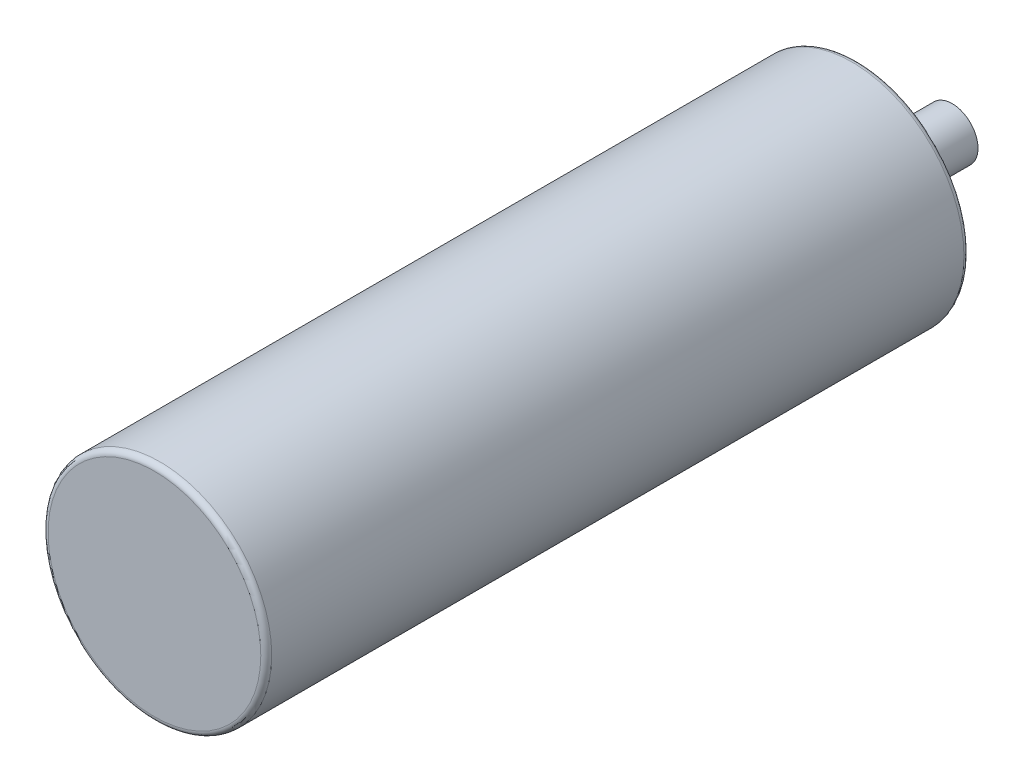
ISO-10303-21;
HEADER;
FILE_DESCRIPTION(('STEP AP214'),'2;1');
FILE_NAME('part.step','',(''),(''),'','','');
FILE_SCHEMA(('AUTOMOTIVE_DESIGN { 1 0 10303 214 1 1 1 1 }'));
ENDSEC;
DATA;
#1=APPLICATION_CONTEXT('core data for automotive mechanical design processes');
#2=APPLICATION_PROTOCOL_DEFINITION('international standard','automotive_design',2000,#1);
#3=PRODUCT_CONTEXT('',#1,'mechanical');
#4=PRODUCT('Part','Part','',(#3));
#5=PRODUCT_RELATED_PRODUCT_CATEGORY('part','',(#4));
#6=PRODUCT_DEFINITION_FORMATION('','',#4);
#7=PRODUCT_DEFINITION_CONTEXT('part definition',#1,'design');
#8=PRODUCT_DEFINITION('design','',#6,#7);
#9=PRODUCT_DEFINITION_SHAPE('','',#8);
#10=(LENGTH_UNIT() NAMED_UNIT(*) SI_UNIT(.MILLI.,.METRE.));
#11=(NAMED_UNIT(*) PLANE_ANGLE_UNIT() SI_UNIT($,.RADIAN.));
#12=(NAMED_UNIT(*) SI_UNIT($,.STERADIAN.) SOLID_ANGLE_UNIT());
#13=UNCERTAINTY_MEASURE_WITH_UNIT(LENGTH_MEASURE(1.E-05),#10,'distance_accuracy_value','');
#14=(GEOMETRIC_REPRESENTATION_CONTEXT(3) GLOBAL_UNCERTAINTY_ASSIGNED_CONTEXT((#13)) GLOBAL_UNIT_ASSIGNED_CONTEXT((#10,
#11,#12)) REPRESENTATION_CONTEXT('',''));
#15=CARTESIAN_POINT('',(0.,0.,0.));
#16=DIRECTION('',(0.,0.,1.));
#17=DIRECTION('',(1.,0.,0.));
#18=AXIS2_PLACEMENT_3D('',#15,#16,#17);
#19=CARTESIAN_POINT('',(0.,0.,-22.));
#20=DIRECTION('',(0.,0.,1.));
#21=DIRECTION('',(1.,0.,0.));
#22=AXIS2_PLACEMENT_3D('',#19,#20,#21);
#23=CYLINDRICAL_SURFACE('',#22,6.);
#24=CARTESIAN_POINT('',(0.,0.,0.));
#25=DIRECTION('',(0.,0.,1.));
#26=DIRECTION('',(1.,0.,0.));
#27=AXIS2_PLACEMENT_3D('',#24,#25,#26);
#28=CIRCLE('',#27,6.);
#29=CARTESIAN_POINT('',(6.,0.,0.));
#30=VERTEX_POINT('',#29);
#31=EDGE_CURVE('E124',#30,#30,#28,.F.);
#32=ORIENTED_EDGE('',*,*,#31,.T.);
#33=EDGE_LOOP('',(#32));
#34=FACE_BOUND('',#33,.T.);
#35=DIRECTION('',(0.,0.,-1.));
#36=VECTOR('',#35,1.);
#37=CARTESIAN_POINT('',(4.47213595499958,-4.,-7.));
#38=LINE('',#37,#36);
#39=CARTESIAN_POINT('',(4.47213595499958,-4.,-7.));
#40=VERTEX_POINT('',#39);
#41=CARTESIAN_POINT('',(4.47213595499958,-4.,-22.));
#42=VERTEX_POINT('',#41);
#43=EDGE_CURVE('E117',#40,#42,#38,.T.);
#44=ORIENTED_EDGE('',*,*,#43,.T.);
#45=CARTESIAN_POINT('',(0.,0.,-22.));
#46=DIRECTION('',(0.,0.,-1.));
#47=DIRECTION('',(-1.,0.,0.));
#48=AXIS2_PLACEMENT_3D('',#45,#46,#47);
#49=CIRCLE('',#48,6.);
#50=CARTESIAN_POINT('',(-4.47213595499958,-4.,-22.));
#51=VERTEX_POINT('',#50);
#52=EDGE_CURVE('E120',#51,#42,#49,.T.);
#53=ORIENTED_EDGE('',*,*,#52,.F.);
#54=DIRECTION('',(0.,0.,-1.));
#55=VECTOR('',#54,1.);
#56=CARTESIAN_POINT('',(-4.47213595499958,-4.,-7.));
#57=LINE('',#56,#55);
#58=CARTESIAN_POINT('',(-4.47213595499958,-4.,-7.));
#59=VERTEX_POINT('',#58);
#60=EDGE_CURVE('E49',#59,#51,#57,.T.);
#61=ORIENTED_EDGE('',*,*,#60,.F.);
#62=CARTESIAN_POINT('',(0.,0.,-7.));
#63=DIRECTION('',(0.,0.,-1.));
#64=DIRECTION('',(-1.,0.,0.));
#65=AXIS2_PLACEMENT_3D('',#62,#63,#64);
#66=CIRCLE('',#65,6.);
#67=EDGE_CURVE('E115',#40,#59,#66,.T.);
#68=ORIENTED_EDGE('',*,*,#67,.F.);
#69=EDGE_LOOP('',(#44,#53,#61,#68));
#70=FACE_BOUND('',#69,.T.);
#71=ADVANCED_FACE('F34',(#34,#70),#23,.T.);
#72=CARTESIAN_POINT('',(0.,0.,-22.));
#73=DIRECTION('',(0.,0.,-1.));
#74=DIRECTION('',(-1.,0.,0.));
#75=AXIS2_PLACEMENT_3D('',#72,#73,#74);
#76=PLANE('',#75);
#77=CARTESIAN_POINT('',(0.,0.,-22.));
#78=DIRECTION('',(0.,0.,-1.));
#79=DIRECTION('',(-1.,0.,0.));
#80=AXIS2_PLACEMENT_3D('',#77,#78,#79);
#81=CIRCLE('',#80,1.016);
#82=CARTESIAN_POINT('',(-1.016,0.,-22.));
#83=VERTEX_POINT('',#82);
#84=EDGE_CURVE('E108',#83,#83,#81,.T.);
#85=ORIENTED_EDGE('',*,*,#84,.F.);
#86=EDGE_LOOP('',(#85));
#87=FACE_BOUND('',#86,.T.);
#88=ORIENTED_EDGE('',*,*,#52,.T.);
#89=DIRECTION('',(-1.,0.,0.));
#90=VECTOR('',#89,1.);
#91=CARTESIAN_POINT('',(0.,-4.,-22.));
#92=LINE('',#91,#90);
#93=EDGE_CURVE('E61',#42,#51,#92,.T.);
#94=ORIENTED_EDGE('',*,*,#93,.T.);
#95=EDGE_LOOP('',(#88,#94));
#96=FACE_BOUND('',#95,.T.);
#97=ADVANCED_FACE('F155',(#87,#96),#76,.T.);
#98=CARTESIAN_POINT('',(0.,0.,163.5));
#99=DIRECTION('',(0.,0.,-1.));
#100=DIRECTION('',(-1.,0.,0.));
#101=AXIS2_PLACEMENT_3D('',#98,#99,#100);
#102=CYLINDRICAL_SURFACE('',#101,26.);
#103=CARTESIAN_POINT('',(0.,0.,162.23));
#104=DIRECTION('',(0.,0.,1.));
#105=DIRECTION('',(1.,0.,0.));
#106=AXIS2_PLACEMENT_3D('',#103,#104,#105);
#107=CIRCLE('',#106,26.);
#108=CARTESIAN_POINT('',(26.,0.,162.23));
#109=VERTEX_POINT('',#108);
#110=EDGE_CURVE('E42',#109,#109,#107,.F.);
#111=ORIENTED_EDGE('',*,*,#110,.T.);
#112=EDGE_LOOP('',(#111));
#113=FACE_BOUND('',#112,.T.);
#114=CARTESIAN_POINT('',(0.,0.,1.26999999999999));
#115=DIRECTION('',(0.,0.,1.));
#116=DIRECTION('',(1.,0.,0.));
#117=AXIS2_PLACEMENT_3D('',#114,#115,#116);
#118=CIRCLE('',#117,26.);
#119=CARTESIAN_POINT('',(26.,0.,1.26999999999999));
#120=VERTEX_POINT('',#119);
#121=EDGE_CURVE('E130',#120,#120,#118,.T.);
#122=ORIENTED_EDGE('',*,*,#121,.T.);
#123=EDGE_LOOP('',(#122));
#124=FACE_BOUND('',#123,.T.);
#125=ADVANCED_FACE('F135',(#113,#124),#102,.T.);
#126=CARTESIAN_POINT('',(0.,0.,163.5));
#127=DIRECTION('',(0.,0.,1.));
#128=DIRECTION('',(1.,0.,0.));
#129=AXIS2_PLACEMENT_3D('',#126,#127,#128);
#130=PLANE('',#129);
#131=CARTESIAN_POINT('',(0.,0.,163.5));
#132=DIRECTION('',(0.,0.,1.));
#133=DIRECTION('',(1.,0.,0.));
#134=AXIS2_PLACEMENT_3D('',#131,#132,#133);
#135=CIRCLE('',#134,24.73);
#136=CARTESIAN_POINT('',(24.73,0.,163.5));
#137=VERTEX_POINT('',#136);
#138=EDGE_CURVE('E127',#137,#137,#135,.T.);
#139=ORIENTED_EDGE('',*,*,#138,.T.);
#140=EDGE_LOOP('',(#139));
#141=FACE_BOUND('',#140,.T.);
#142=ADVANCED_FACE('F143',(#141),#130,.T.);
#143=CARTESIAN_POINT('',(0.,0.,0.));
#144=DIRECTION('',(0.,0.,1.));
#145=DIRECTION('',(1.,0.,0.));
#146=AXIS2_PLACEMENT_3D('',#143,#144,#145);
#147=PLANE('',#146);
#148=CARTESIAN_POINT('',(0.,0.,0.));
#149=DIRECTION('',(0.,0.,1.));
#150=DIRECTION('',(1.,0.,0.));
#151=AXIS2_PLACEMENT_3D('',#148,#149,#150);
#152=CIRCLE('',#151,24.73);
#153=CARTESIAN_POINT('',(24.73,0.,0.));
#154=VERTEX_POINT('',#153);
#155=EDGE_CURVE('E11',#154,#154,#152,.F.);
#156=ORIENTED_EDGE('',*,*,#155,.T.);
#157=EDGE_LOOP('',(#156));
#158=FACE_BOUND('',#157,.T.);
#159=CARTESIAN_POINT('',(0.,-20.,0.));
#160=DIRECTION('',(0.,0.,-1.));
#161=DIRECTION('',(-1.,0.,0.));
#162=AXIS2_PLACEMENT_3D('',#159,#160,#161);
#163=CIRCLE('',#162,2.09999999999999);
#164=CARTESIAN_POINT('',(-2.09999999999999,-20.,0.));
#165=VERTEX_POINT('',#164);
#166=EDGE_CURVE('E86',#165,#165,#163,.T.);
#167=ORIENTED_EDGE('',*,*,#166,.F.);
#168=EDGE_LOOP('',(#167));
#169=FACE_BOUND('',#168,.T.);
#170=CARTESIAN_POINT('',(20.,0.,0.));
#171=DIRECTION('',(0.,0.,-1.));
#172=DIRECTION('',(-1.,0.,0.));
#173=AXIS2_PLACEMENT_3D('',#170,#171,#172);
#174=CIRCLE('',#173,2.09999999999999);
#175=CARTESIAN_POINT('',(17.9,0.,0.));
#176=VERTEX_POINT('',#175);
#177=EDGE_CURVE('E85',#176,#176,#174,.T.);
#178=ORIENTED_EDGE('',*,*,#177,.F.);
#179=EDGE_LOOP('',(#178));
#180=FACE_BOUND('',#179,.T.);
#181=CARTESIAN_POINT('',(0.,20.,0.));
#182=DIRECTION('',(0.,0.,-1.));
#183=DIRECTION('',(-1.,0.,0.));
#184=AXIS2_PLACEMENT_3D('',#181,#182,#183);
#185=CIRCLE('',#184,2.09999999999999);
#186=CARTESIAN_POINT('',(-2.09999999999999,20.,0.));
#187=VERTEX_POINT('',#186);
#188=EDGE_CURVE('E96',#187,#187,#185,.T.);
#189=ORIENTED_EDGE('',*,*,#188,.F.);
#190=EDGE_LOOP('',(#189));
#191=FACE_BOUND('',#190,.T.);
#192=CARTESIAN_POINT('',(-20.,0.,0.));
#193=DIRECTION('',(0.,0.,-1.));
#194=DIRECTION('',(-1.,0.,0.));
#195=AXIS2_PLACEMENT_3D('',#192,#193,#194);
#196=CIRCLE('',#195,2.09999999999999);
#197=CARTESIAN_POINT('',(-22.1,0.,0.));
#198=VERTEX_POINT('',#197);
#199=EDGE_CURVE('E102',#198,#198,#196,.T.);
#200=ORIENTED_EDGE('',*,*,#199,.F.);
#201=EDGE_LOOP('',(#200));
#202=FACE_BOUND('',#201,.T.);
#203=ORIENTED_EDGE('',*,*,#31,.F.);
#204=EDGE_LOOP('',(#203));
#205=FACE_BOUND('',#204,.T.);
#206=ADVANCED_FACE('F145',(#158,#169,#180,#191,#202,#205),#147,.F.);
#207=CARTESIAN_POINT('',(0.,-4.,-7.));
#208=DIRECTION('',(0.,-1.,0.));
#209=DIRECTION('',(0.,0.,-1.));
#210=AXIS2_PLACEMENT_3D('',#207,#208,#209);
#211=PLANE('',#210);
#212=ORIENTED_EDGE('',*,*,#93,.F.);
#213=ORIENTED_EDGE('',*,*,#43,.F.);
#214=DIRECTION('',(-1.,0.,0.));
#215=VECTOR('',#214,1.);
#216=CARTESIAN_POINT('',(0.,-4.,-7.));
#217=LINE('',#216,#215);
#218=EDGE_CURVE('E55',#40,#59,#217,.T.);
#219=ORIENTED_EDGE('',*,*,#218,.T.);
#220=ORIENTED_EDGE('',*,*,#60,.T.);
#221=EDGE_LOOP('',(#212,#213,#219,#220));
#222=FACE_BOUND('',#221,.T.);
#223=ADVANCED_FACE('F152',(#222),#211,.T.);
#224=CARTESIAN_POINT('',(0.,0.,-7.));
#225=DIRECTION('',(0.,0.,-1.));
#226=DIRECTION('',(-1.,0.,0.));
#227=AXIS2_PLACEMENT_3D('',#224,#225,#226);
#228=PLANE('',#227);
#229=ORIENTED_EDGE('',*,*,#218,.F.);
#230=ORIENTED_EDGE('',*,*,#67,.T.);
#231=EDGE_LOOP('',(#229,#230));
#232=FACE_BOUND('',#231,.T.);
#233=ADVANCED_FACE('F169',(#232),#228,.T.);
#234=CARTESIAN_POINT('',(0.,0.,-7.));
#235=DIRECTION('',(0.,0.,-1.));
#236=DIRECTION('',(-1.,0.,0.));
#237=AXIS2_PLACEMENT_3D('',#234,#235,#236);
#238=CYLINDRICAL_SURFACE('',#237,1.016);
#239=CARTESIAN_POINT('',(0.,0.,-7.));
#240=DIRECTION('',(0.,0.,-1.));
#241=DIRECTION('',(-1.,0.,0.));
#242=AXIS2_PLACEMENT_3D('',#239,#240,#241);
#243=CIRCLE('',#242,1.016);
#244=CARTESIAN_POINT('',(-1.016,0.,-7.));
#245=VERTEX_POINT('',#244);
#246=EDGE_CURVE('E109',#245,#245,#243,.T.);
#247=ORIENTED_EDGE('',*,*,#246,.F.);
#248=EDGE_LOOP('',(#247));
#249=FACE_BOUND('',#248,.T.);
#250=ORIENTED_EDGE('',*,*,#84,.T.);
#251=EDGE_LOOP('',(#250));
#252=FACE_BOUND('',#251,.T.);
#253=ADVANCED_FACE('F172',(#249,#252),#238,.F.);
#254=CARTESIAN_POINT('',(0.,0.,-7.));
#255=DIRECTION('',(0.,0.,-1.));
#256=DIRECTION('',(-1.,0.,0.));
#257=AXIS2_PLACEMENT_3D('',#254,#255,#256);
#258=PLANE('',#257);
#259=ORIENTED_EDGE('',*,*,#246,.T.);
#260=EDGE_LOOP('',(#259));
#261=FACE_BOUND('',#260,.T.);
#262=ADVANCED_FACE('F176',(#261),#258,.T.);
#263=CARTESIAN_POINT('',(-20.,0.,32.0000122));
#264=DIRECTION('',(0.,0.,-1.));
#265=DIRECTION('',(-1.,0.,0.));
#266=AXIS2_PLACEMENT_3D('',#263,#264,#265);
#267=CONICAL_SURFACE('',#266,2.09999999999999,1.02974425867665);
#268=CARTESIAN_POINT('',(-20.,0.,33.2618194999579));
#269=VERTEX_POINT('',#268);
#270=VERTEX_LOOP('',#269);
#271=FACE_BOUND('',#270,.T.);
#272=CARTESIAN_POINT('',(-20.,0.,32.0000122));
#273=DIRECTION('',(0.,0.,-1.));
#274=DIRECTION('',(-1.,0.,0.));
#275=AXIS2_PLACEMENT_3D('',#272,#273,#274);
#276=CIRCLE('',#275,2.09999999999999);
#277=CARTESIAN_POINT('',(-22.1,0.,32.0000122));
#278=VERTEX_POINT('',#277);
#279=EDGE_CURVE('E105',#278,#278,#276,.T.);
#280=ORIENTED_EDGE('',*,*,#279,.T.);
#281=EDGE_LOOP('',(#280));
#282=FACE_BOUND('',#281,.T.);
#283=ADVANCED_FACE('F180',(#271,#282),#267,.F.);
#284=CARTESIAN_POINT('',(-20.,0.,0.));
#285=DIRECTION('',(0.,0.,-1.));
#286=DIRECTION('',(-1.,0.,0.));
#287=AXIS2_PLACEMENT_3D('',#284,#285,#286);
#288=CYLINDRICAL_SURFACE('',#287,2.09999999999999);
#289=ORIENTED_EDGE('',*,*,#279,.F.);
#290=EDGE_LOOP('',(#289));
#291=FACE_BOUND('',#290,.T.);
#292=ORIENTED_EDGE('',*,*,#199,.T.);
#293=EDGE_LOOP('',(#292));
#294=FACE_BOUND('',#293,.T.);
#295=ADVANCED_FACE('F184',(#291,#294),#288,.F.);
#296=CARTESIAN_POINT('',(0.,20.,32.0000122));
#297=DIRECTION('',(0.,0.,-1.));
#298=DIRECTION('',(-1.,0.,0.));
#299=AXIS2_PLACEMENT_3D('',#296,#297,#298);
#300=CONICAL_SURFACE('',#299,2.1,1.02974425867665);
#301=CARTESIAN_POINT('',(0.,20.,33.2618194999579));
#302=VERTEX_POINT('',#301);
#303=VERTEX_LOOP('',#302);
#304=FACE_BOUND('',#303,.T.);
#305=CARTESIAN_POINT('',(0.,20.,32.0000122));
#306=DIRECTION('',(0.,0.,-1.));
#307=DIRECTION('',(-1.,0.,0.));
#308=AXIS2_PLACEMENT_3D('',#305,#306,#307);
#309=CIRCLE('',#308,2.1);
#310=CARTESIAN_POINT('',(-2.1,20.,32.0000122));
#311=VERTEX_POINT('',#310);
#312=EDGE_CURVE('E99',#311,#311,#309,.T.);
#313=ORIENTED_EDGE('',*,*,#312,.T.);
#314=EDGE_LOOP('',(#313));
#315=FACE_BOUND('',#314,.T.);
#316=ADVANCED_FACE('F187',(#304,#315),#300,.F.);
#317=CARTESIAN_POINT('',(0.,20.,0.));
#318=DIRECTION('',(0.,0.,-1.));
#319=DIRECTION('',(-1.,0.,0.));
#320=AXIS2_PLACEMENT_3D('',#317,#318,#319);
#321=CYLINDRICAL_SURFACE('',#320,2.09999999999999);
#322=ORIENTED_EDGE('',*,*,#312,.F.);
#323=EDGE_LOOP('',(#322));
#324=FACE_BOUND('',#323,.T.);
#325=ORIENTED_EDGE('',*,*,#188,.T.);
#326=EDGE_LOOP('',(#325));
#327=FACE_BOUND('',#326,.T.);
#328=ADVANCED_FACE('F191',(#324,#327),#321,.F.);
#329=CARTESIAN_POINT('',(20.,0.,32.0000122));
#330=DIRECTION('',(0.,0.,-1.));
#331=DIRECTION('',(-1.,0.,0.));
#332=AXIS2_PLACEMENT_3D('',#329,#330,#331);
#333=CONICAL_SURFACE('',#332,2.09999999999999,1.02974425867665);
#334=CARTESIAN_POINT('',(20.,0.,33.2618194999579));
#335=VERTEX_POINT('',#334);
#336=VERTEX_LOOP('',#335);
#337=FACE_BOUND('',#336,.T.);
#338=CARTESIAN_POINT('',(20.,0.,32.0000122));
#339=DIRECTION('',(0.,0.,-1.));
#340=DIRECTION('',(-1.,0.,0.));
#341=AXIS2_PLACEMENT_3D('',#338,#339,#340);
#342=CIRCLE('',#341,2.09999999999999);
#343=CARTESIAN_POINT('',(17.9,0.,32.0000122));
#344=VERTEX_POINT('',#343);
#345=EDGE_CURVE('E89',#344,#344,#342,.T.);
#346=ORIENTED_EDGE('',*,*,#345,.T.);
#347=EDGE_LOOP('',(#346));
#348=FACE_BOUND('',#347,.T.);
#349=ADVANCED_FACE('F195',(#337,#348),#333,.F.);
#350=CARTESIAN_POINT('',(20.,0.,0.));
#351=DIRECTION('',(0.,0.,-1.));
#352=DIRECTION('',(-1.,0.,0.));
#353=AXIS2_PLACEMENT_3D('',#350,#351,#352);
#354=CYLINDRICAL_SURFACE('',#353,2.09999999999999);
#355=ORIENTED_EDGE('',*,*,#345,.F.);
#356=EDGE_LOOP('',(#355));
#357=FACE_BOUND('',#356,.T.);
#358=ORIENTED_EDGE('',*,*,#177,.T.);
#359=EDGE_LOOP('',(#358));
#360=FACE_BOUND('',#359,.T.);
#361=ADVANCED_FACE('F79',(#357,#360),#354,.F.);
#362=CARTESIAN_POINT('',(0.,-20.,32.0000122));
#363=DIRECTION('',(0.,0.,-1.));
#364=DIRECTION('',(-1.,0.,0.));
#365=AXIS2_PLACEMENT_3D('',#362,#363,#364);
#366=CONICAL_SURFACE('',#365,2.1,1.02974425867665);
#367=CARTESIAN_POINT('',(0.,-20.,33.2618194999579));
#368=VERTEX_POINT('',#367);
#369=VERTEX_LOOP('',#368);
#370=FACE_BOUND('',#369,.T.);
#371=CARTESIAN_POINT('',(0.,-20.,32.0000122));
#372=DIRECTION('',(0.,0.,-1.));
#373=DIRECTION('',(-1.,0.,0.));
#374=AXIS2_PLACEMENT_3D('',#371,#372,#373);
#375=CIRCLE('',#374,2.1);
#376=CARTESIAN_POINT('',(-2.1,-20.,32.0000122));
#377=VERTEX_POINT('',#376);
#378=EDGE_CURVE('E83',#377,#377,#375,.T.);
#379=ORIENTED_EDGE('',*,*,#378,.T.);
#380=EDGE_LOOP('',(#379));
#381=FACE_BOUND('',#380,.T.);
#382=ADVANCED_FACE('F75',(#370,#381),#366,.F.);
#383=CARTESIAN_POINT('',(0.,-20.,0.));
#384=DIRECTION('',(0.,0.,-1.));
#385=DIRECTION('',(-1.,0.,0.));
#386=AXIS2_PLACEMENT_3D('',#383,#384,#385);
#387=CYLINDRICAL_SURFACE('',#386,2.09999999999999);
#388=ORIENTED_EDGE('',*,*,#378,.F.);
#389=EDGE_LOOP('',(#388));
#390=FACE_BOUND('',#389,.T.);
#391=ORIENTED_EDGE('',*,*,#166,.T.);
#392=EDGE_LOOP('',(#391));
#393=FACE_BOUND('',#392,.T.);
#394=ADVANCED_FACE('F78',(#390,#393),#387,.F.);
#395=CARTESIAN_POINT('',(0.,0.,162.23));
#396=DIRECTION('',(0.,0.,1.));
#397=DIRECTION('',(1.,0.,0.));
#398=AXIS2_PLACEMENT_3D('',#395,#396,#397);
#399=TOROIDAL_SURFACE('',#398,24.73,1.27);
#400=ORIENTED_EDGE('',*,*,#110,.F.);
#401=EDGE_LOOP('',(#400));
#402=FACE_BOUND('',#401,.T.);
#403=ORIENTED_EDGE('',*,*,#138,.F.);
#404=EDGE_LOOP('',(#403));
#405=FACE_BOUND('',#404,.T.);
#406=ADVANCED_FACE('F138',(#402,#405),#399,.T.);
#407=CARTESIAN_POINT('',(0.,0.,1.26999999999999));
#408=DIRECTION('',(0.,0.,1.));
#409=DIRECTION('',(1.,0.,0.));
#410=AXIS2_PLACEMENT_3D('',#407,#408,#409);
#411=TOROIDAL_SURFACE('',#410,24.73,1.27);
#412=ORIENTED_EDGE('',*,*,#155,.F.);
#413=EDGE_LOOP('',(#412));
#414=FACE_BOUND('',#413,.T.);
#415=ORIENTED_EDGE('',*,*,#121,.F.);
#416=EDGE_LOOP('',(#415));
#417=FACE_BOUND('',#416,.T.);
#418=ADVANCED_FACE('F36',(#414,#417),#411,.T.);
#419=CLOSED_SHELL('',(#71,#97,#125,#142,#206,#223,#233,#253,#262,#283,#295,#316,#328,#349,#361,
#382,#394,#406,#418));
#420=MANIFOLD_SOLID_BREP('B2',#419);
#421=ADVANCED_BREP_SHAPE_REPRESENTATION('',(#18,#420),#14);
#422=SHAPE_DEFINITION_REPRESENTATION(#9,#421);
ENDSEC;
END-ISO-10303-21;
